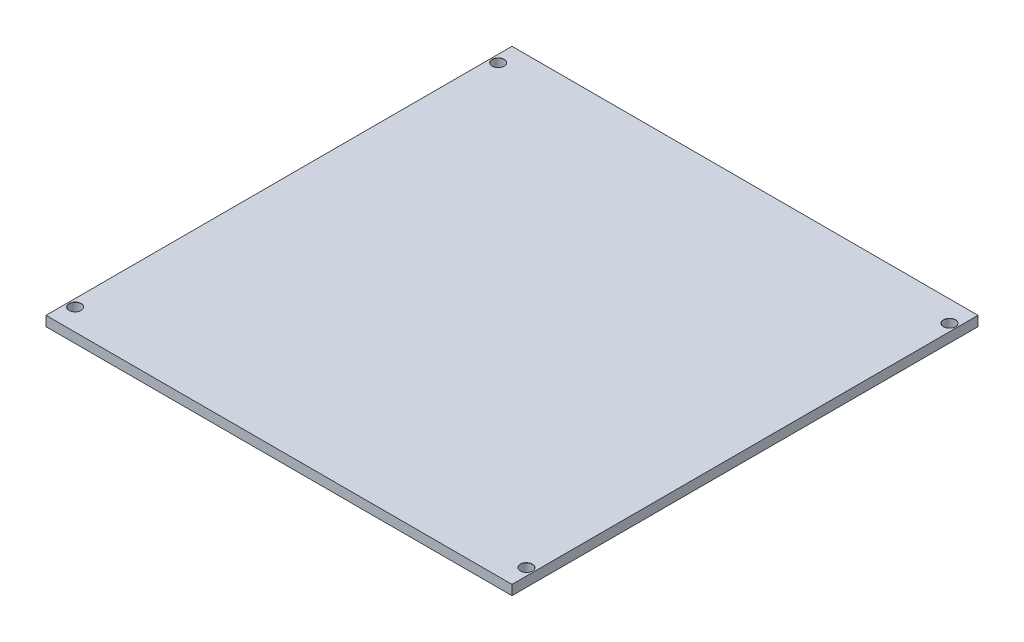
ISO-10303-21;
HEADER;
FILE_DESCRIPTION(('STEP AP214'),'2;1');
FILE_NAME('part.step','',(''),(''),'','','');
FILE_SCHEMA(('AUTOMOTIVE_DESIGN { 1 0 10303 214 1 1 1 1 }'));
ENDSEC;
DATA;
#1=APPLICATION_CONTEXT('core data for automotive mechanical design processes');
#2=APPLICATION_PROTOCOL_DEFINITION('international standard','automotive_design',2000,#1);
#3=PRODUCT_CONTEXT('',#1,'mechanical');
#4=PRODUCT('Part','Part','',(#3));
#5=PRODUCT_RELATED_PRODUCT_CATEGORY('part','',(#4));
#6=PRODUCT_DEFINITION_FORMATION('','',#4);
#7=PRODUCT_DEFINITION_CONTEXT('part definition',#1,'design');
#8=PRODUCT_DEFINITION('design','',#6,#7);
#9=PRODUCT_DEFINITION_SHAPE('','',#8);
#10=(LENGTH_UNIT() NAMED_UNIT(*) SI_UNIT(.MILLI.,.METRE.));
#11=(NAMED_UNIT(*) PLANE_ANGLE_UNIT() SI_UNIT($,.RADIAN.));
#12=(NAMED_UNIT(*) SI_UNIT($,.STERADIAN.) SOLID_ANGLE_UNIT());
#13=UNCERTAINTY_MEASURE_WITH_UNIT(LENGTH_MEASURE(1.E-05),#10,'distance_accuracy_value','');
#14=(GEOMETRIC_REPRESENTATION_CONTEXT(3) GLOBAL_UNCERTAINTY_ASSIGNED_CONTEXT((#13)) GLOBAL_UNIT_ASSIGNED_CONTEXT((#10,
#11,#12)) REPRESENTATION_CONTEXT('',''));
#15=CARTESIAN_POINT('',(0.,0.,0.));
#16=DIRECTION('',(0.,0.,1.));
#17=DIRECTION('',(1.,0.,0.));
#18=AXIS2_PLACEMENT_3D('',#15,#16,#17);
#19=CARTESIAN_POINT('',(0.,2.,0.));
#20=DIRECTION('',(0.,-1.,0.));
#21=DIRECTION('',(0.,0.,-1.));
#22=AXIS2_PLACEMENT_3D('',#19,#20,#21);
#23=PLANE('',#22);
#24=DIRECTION('',(0.,0.,-1.));
#25=VECTOR('',#24,1.);
#26=CARTESIAN_POINT('',(47.375,2.,47.375));
#27=LINE('',#26,#25);
#28=CARTESIAN_POINT('',(47.375,2.,47.375));
#29=VERTEX_POINT('',#28);
#30=CARTESIAN_POINT('',(47.375,2.,-47.375));
#31=VERTEX_POINT('',#30);
#32=EDGE_CURVE('E91',#29,#31,#27,.T.);
#33=ORIENTED_EDGE('',*,*,#32,.T.);
#34=DIRECTION('',(-1.,0.,0.));
#35=VECTOR('',#34,1.);
#36=CARTESIAN_POINT('',(-47.375,2.,-47.375));
#37=LINE('',#36,#35);
#38=CARTESIAN_POINT('',(-47.375,2.,-47.375));
#39=VERTEX_POINT('',#38);
#40=EDGE_CURVE('E86',#31,#39,#37,.T.);
#41=ORIENTED_EDGE('',*,*,#40,.T.);
#42=DIRECTION('',(0.,0.,1.));
#43=VECTOR('',#42,1.);
#44=CARTESIAN_POINT('',(-47.375,2.,47.375));
#45=LINE('',#44,#43);
#46=CARTESIAN_POINT('',(-47.375,2.,47.375));
#47=VERTEX_POINT('',#46);
#48=EDGE_CURVE('E89',#39,#47,#45,.T.);
#49=ORIENTED_EDGE('',*,*,#48,.T.);
#50=DIRECTION('',(1.,0.,0.));
#51=VECTOR('',#50,1.);
#52=CARTESIAN_POINT('',(-47.375,2.,47.375));
#53=LINE('',#52,#51);
#54=EDGE_CURVE('E56',#47,#29,#53,.T.);
#55=ORIENTED_EDGE('',*,*,#54,.T.);
#56=EDGE_LOOP('',(#33,#41,#49,#55));
#57=FACE_BOUND('',#56,.T.);
#58=CARTESIAN_POINT('',(45.875,2.,42.9529288111608));
#59=DIRECTION('',(0.,1.,0.));
#60=DIRECTION('',(0.,0.,1.));
#61=AXIS2_PLACEMENT_3D('',#58,#59,#60);
#62=CIRCLE('',#61,1.225);
#63=CARTESIAN_POINT('',(45.875,2.,44.1779288111608));
#64=VERTEX_POINT('',#63);
#65=EDGE_CURVE('E122',#64,#64,#62,.T.);
#66=ORIENTED_EDGE('',*,*,#65,.F.);
#67=EDGE_LOOP('',(#66));
#68=FACE_BOUND('',#67,.T.);
#69=CARTESIAN_POINT('',(-45.875,2.,42.9411563603076));
#70=DIRECTION('',(0.,1.,0.));
#71=DIRECTION('',(0.,0.,1.));
#72=AXIS2_PLACEMENT_3D('',#69,#70,#71);
#73=CIRCLE('',#72,1.225);
#74=CARTESIAN_POINT('',(-45.875,2.,44.1661563603076));
#75=VERTEX_POINT('',#74);
#76=EDGE_CURVE('E131',#75,#75,#73,.T.);
#77=ORIENTED_EDGE('',*,*,#76,.F.);
#78=EDGE_LOOP('',(#77));
#79=FACE_BOUND('',#78,.T.);
#80=CARTESIAN_POINT('',(-45.875,2.,-43.0719982494284));
#81=DIRECTION('',(0.,1.,0.));
#82=DIRECTION('',(0.,0.,1.));
#83=AXIS2_PLACEMENT_3D('',#80,#81,#82);
#84=CIRCLE('',#83,1.225);
#85=CARTESIAN_POINT('',(-45.875,2.,-41.8469982494284));
#86=VERTEX_POINT('',#85);
#87=EDGE_CURVE('E140',#86,#86,#84,.T.);
#88=ORIENTED_EDGE('',*,*,#87,.F.);
#89=EDGE_LOOP('',(#88));
#90=FACE_BOUND('',#89,.T.);
#91=CARTESIAN_POINT('',(45.875,2.,-43.0838884368115));
#92=DIRECTION('',(0.,1.,0.));
#93=DIRECTION('',(0.,0.,1.));
#94=AXIS2_PLACEMENT_3D('',#91,#92,#93);
#95=CIRCLE('',#94,1.225);
#96=CARTESIAN_POINT('',(45.875,2.,-41.8588884368115));
#97=VERTEX_POINT('',#96);
#98=EDGE_CURVE('E149',#97,#97,#95,.T.);
#99=ORIENTED_EDGE('',*,*,#98,.F.);
#100=EDGE_LOOP('',(#99));
#101=FACE_BOUND('',#100,.T.);
#102=ADVANCED_FACE('F39',(#57,#68,#79,#90,#101),#23,.F.);
#103=CARTESIAN_POINT('',(47.375,2.,47.375));
#104=DIRECTION('',(-1.,0.,0.));
#105=DIRECTION('',(0.,0.,1.));
#106=AXIS2_PLACEMENT_3D('',#103,#104,#105);
#107=PLANE('',#106);
#108=DIRECTION('',(0.,0.,-1.));
#109=VECTOR('',#108,1.);
#110=CARTESIAN_POINT('',(47.375,0.,47.375));
#111=LINE('',#110,#109);
#112=CARTESIAN_POINT('',(47.375,0.,47.375));
#113=VERTEX_POINT('',#112);
#114=CARTESIAN_POINT('',(47.375,0.,-47.375));
#115=VERTEX_POINT('',#114);
#116=EDGE_CURVE('E103',#113,#115,#111,.T.);
#117=ORIENTED_EDGE('',*,*,#116,.T.);
#118=DIRECTION('',(0.,-1.,0.));
#119=VECTOR('',#118,1.);
#120=CARTESIAN_POINT('',(47.375,2.,-47.375));
#121=LINE('',#120,#119);
#122=EDGE_CURVE('E11',#31,#115,#121,.T.);
#123=ORIENTED_EDGE('',*,*,#122,.F.);
#124=ORIENTED_EDGE('',*,*,#32,.F.);
#125=DIRECTION('',(0.,-1.,0.));
#126=VECTOR('',#125,1.);
#127=CARTESIAN_POINT('',(47.375,2.,47.375));
#128=LINE('',#127,#126);
#129=EDGE_CURVE('E99',#29,#113,#128,.T.);
#130=ORIENTED_EDGE('',*,*,#129,.T.);
#131=EDGE_LOOP('',(#117,#123,#124,#130));
#132=FACE_BOUND('',#131,.T.);
#133=ADVANCED_FACE('F41',(#132),#107,.F.);
#134=CARTESIAN_POINT('',(-47.375,2.,-47.375));
#135=DIRECTION('',(0.,0.,1.));
#136=DIRECTION('',(1.,0.,0.));
#137=AXIS2_PLACEMENT_3D('',#134,#135,#136);
#138=PLANE('',#137);
#139=DIRECTION('',(-1.,0.,0.));
#140=VECTOR('',#139,1.);
#141=CARTESIAN_POINT('',(-47.375,0.,-47.375));
#142=LINE('',#141,#140);
#143=CARTESIAN_POINT('',(-47.375,0.,-47.375));
#144=VERTEX_POINT('',#143);
#145=EDGE_CURVE('E95',#115,#144,#142,.T.);
#146=ORIENTED_EDGE('',*,*,#145,.T.);
#147=DIRECTION('',(0.,-1.,0.));
#148=VECTOR('',#147,1.);
#149=CARTESIAN_POINT('',(-47.375,2.,-47.375));
#150=LINE('',#149,#148);
#151=EDGE_CURVE('E48',#39,#144,#150,.T.);
#152=ORIENTED_EDGE('',*,*,#151,.F.);
#153=ORIENTED_EDGE('',*,*,#40,.F.);
#154=ORIENTED_EDGE('',*,*,#122,.T.);
#155=EDGE_LOOP('',(#146,#152,#153,#154));
#156=FACE_BOUND('',#155,.T.);
#157=ADVANCED_FACE('F94',(#156),#138,.F.);
#158=CARTESIAN_POINT('',(-47.375,2.,47.375));
#159=DIRECTION('',(1.,0.,0.));
#160=DIRECTION('',(0.,0.,-1.));
#161=AXIS2_PLACEMENT_3D('',#158,#159,#160);
#162=PLANE('',#161);
#163=DIRECTION('',(0.,0.,1.));
#164=VECTOR('',#163,1.);
#165=CARTESIAN_POINT('',(-47.375,0.,47.375));
#166=LINE('',#165,#164);
#167=CARTESIAN_POINT('',(-47.375,0.,47.375));
#168=VERTEX_POINT('',#167);
#169=EDGE_CURVE('E73',#144,#168,#166,.T.);
#170=ORIENTED_EDGE('',*,*,#169,.T.);
#171=DIRECTION('',(0.,-1.,0.));
#172=VECTOR('',#171,1.);
#173=CARTESIAN_POINT('',(-47.375,2.,47.375));
#174=LINE('',#173,#172);
#175=EDGE_CURVE('E96',#47,#168,#174,.T.);
#176=ORIENTED_EDGE('',*,*,#175,.F.);
#177=ORIENTED_EDGE('',*,*,#48,.F.);
#178=ORIENTED_EDGE('',*,*,#151,.T.);
#179=EDGE_LOOP('',(#170,#176,#177,#178));
#180=FACE_BOUND('',#179,.T.);
#181=ADVANCED_FACE('F97',(#180),#162,.F.);
#182=CARTESIAN_POINT('',(-47.375,2.,47.375));
#183=DIRECTION('',(0.,0.,-1.));
#184=DIRECTION('',(-1.,0.,0.));
#185=AXIS2_PLACEMENT_3D('',#182,#183,#184);
#186=PLANE('',#185);
#187=DIRECTION('',(1.,0.,0.));
#188=VECTOR('',#187,1.);
#189=CARTESIAN_POINT('',(-47.375,0.,47.375));
#190=LINE('',#189,#188);
#191=EDGE_CURVE('E79',#168,#113,#190,.T.);
#192=ORIENTED_EDGE('',*,*,#191,.T.);
#193=ORIENTED_EDGE('',*,*,#129,.F.);
#194=ORIENTED_EDGE('',*,*,#54,.F.);
#195=ORIENTED_EDGE('',*,*,#175,.T.);
#196=EDGE_LOOP('',(#192,#193,#194,#195));
#197=FACE_BOUND('',#196,.T.);
#198=ADVANCED_FACE('F111',(#197),#186,.F.);
#199=CARTESIAN_POINT('',(0.,0.,0.));
#200=DIRECTION('',(0.,-1.,0.));
#201=DIRECTION('',(0.,0.,-1.));
#202=AXIS2_PLACEMENT_3D('',#199,#200,#201);
#203=PLANE('',#202);
#204=CARTESIAN_POINT('',(45.875,0.,-43.0838884368115));
#205=DIRECTION('',(0.,-1.,0.));
#206=DIRECTION('',(0.,0.,-1.));
#207=AXIS2_PLACEMENT_3D('',#204,#205,#206);
#208=CIRCLE('',#207,1.2);
#209=CARTESIAN_POINT('',(45.875,0.,-44.2838884368115));
#210=VERTEX_POINT('',#209);
#211=EDGE_CURVE('E143',#210,#210,#208,.T.);
#212=ORIENTED_EDGE('',*,*,#211,.F.);
#213=EDGE_LOOP('',(#212));
#214=FACE_BOUND('',#213,.T.);
#215=CARTESIAN_POINT('',(-45.875,0.,-43.0719982494284));
#216=DIRECTION('',(0.,-1.,0.));
#217=DIRECTION('',(0.,0.,-1.));
#218=AXIS2_PLACEMENT_3D('',#215,#216,#217);
#219=CIRCLE('',#218,1.2);
#220=CARTESIAN_POINT('',(-45.875,0.,-44.2719982494284));
#221=VERTEX_POINT('',#220);
#222=EDGE_CURVE('E134',#221,#221,#219,.T.);
#223=ORIENTED_EDGE('',*,*,#222,.F.);
#224=EDGE_LOOP('',(#223));
#225=FACE_BOUND('',#224,.T.);
#226=CARTESIAN_POINT('',(-45.875,0.,42.9411563603076));
#227=DIRECTION('',(0.,-1.,0.));
#228=DIRECTION('',(0.,0.,-1.));
#229=AXIS2_PLACEMENT_3D('',#226,#227,#228);
#230=CIRCLE('',#229,1.2);
#231=CARTESIAN_POINT('',(-45.875,0.,41.7411563603076));
#232=VERTEX_POINT('',#231);
#233=EDGE_CURVE('E125',#232,#232,#230,.T.);
#234=ORIENTED_EDGE('',*,*,#233,.F.);
#235=EDGE_LOOP('',(#234));
#236=FACE_BOUND('',#235,.T.);
#237=CARTESIAN_POINT('',(45.875,0.,42.9529288111608));
#238=DIRECTION('',(0.,-1.,0.));
#239=DIRECTION('',(0.,0.,-1.));
#240=AXIS2_PLACEMENT_3D('',#237,#238,#239);
#241=CIRCLE('',#240,1.2);
#242=CARTESIAN_POINT('',(45.875,0.,41.7529288111608));
#243=VERTEX_POINT('',#242);
#244=EDGE_CURVE('E106',#243,#243,#241,.T.);
#245=ORIENTED_EDGE('',*,*,#244,.F.);
#246=EDGE_LOOP('',(#245));
#247=FACE_BOUND('',#246,.T.);
#248=ORIENTED_EDGE('',*,*,#116,.F.);
#249=ORIENTED_EDGE('',*,*,#191,.F.);
#250=ORIENTED_EDGE('',*,*,#169,.F.);
#251=ORIENTED_EDGE('',*,*,#145,.F.);
#252=EDGE_LOOP('',(#248,#249,#250,#251));
#253=FACE_BOUND('',#252,.T.);
#254=ADVANCED_FACE('F114',(#214,#225,#236,#247,#253),#203,.T.);
#255=CARTESIAN_POINT('',(45.875,2.,42.9529288111608));
#256=DIRECTION('',(0.,1.,0.));
#257=DIRECTION('',(0.,0.,1.));
#258=AXIS2_PLACEMENT_3D('',#255,#256,#257);
#259=CYLINDRICAL_SURFACE('',#258,1.2);
#260=CARTESIAN_POINT('',(45.875,1.975,42.9529288111608));
#261=DIRECTION('',(0.,1.,0.));
#262=DIRECTION('',(0.,0.,1.));
#263=AXIS2_PLACEMENT_3D('',#260,#261,#262);
#264=CIRCLE('',#263,1.2);
#265=CARTESIAN_POINT('',(45.875,1.975,44.1529288111608));
#266=VERTEX_POINT('',#265);
#267=EDGE_CURVE('E119',#266,#266,#264,.T.);
#268=ORIENTED_EDGE('',*,*,#267,.T.);
#269=EDGE_LOOP('',(#268));
#270=FACE_BOUND('',#269,.T.);
#271=ORIENTED_EDGE('',*,*,#244,.T.);
#272=EDGE_LOOP('',(#271));
#273=FACE_BOUND('',#272,.T.);
#274=ADVANCED_FACE('F164',(#270,#273),#259,.F.);
#275=CARTESIAN_POINT('',(45.875,2.,42.9529288111608));
#276=DIRECTION('',(0.,1.,0.));
#277=DIRECTION('',(0.,0.,1.));
#278=AXIS2_PLACEMENT_3D('',#275,#276,#277);
#279=CONICAL_SURFACE('',#278,1.225,0.785398163397396);
#280=ORIENTED_EDGE('',*,*,#267,.F.);
#281=EDGE_LOOP('',(#280));
#282=FACE_BOUND('',#281,.T.);
#283=ORIENTED_EDGE('',*,*,#65,.T.);
#284=EDGE_LOOP('',(#283));
#285=FACE_BOUND('',#284,.T.);
#286=ADVANCED_FACE('F205',(#282,#285),#279,.F.);
#287=CARTESIAN_POINT('',(-45.875,2.,42.9411563603076));
#288=DIRECTION('',(0.,1.,0.));
#289=DIRECTION('',(0.,0.,1.));
#290=AXIS2_PLACEMENT_3D('',#287,#288,#289);
#291=CYLINDRICAL_SURFACE('',#290,1.2);
#292=CARTESIAN_POINT('',(-45.875,1.975,42.9411563603076));
#293=DIRECTION('',(0.,1.,0.));
#294=DIRECTION('',(0.,0.,1.));
#295=AXIS2_PLACEMENT_3D('',#292,#293,#294);
#296=CIRCLE('',#295,1.2);
#297=CARTESIAN_POINT('',(-45.875,1.975,44.1411563603076));
#298=VERTEX_POINT('',#297);
#299=EDGE_CURVE('E128',#298,#298,#296,.T.);
#300=ORIENTED_EDGE('',*,*,#299,.T.);
#301=EDGE_LOOP('',(#300));
#302=FACE_BOUND('',#301,.T.);
#303=ORIENTED_EDGE('',*,*,#233,.T.);
#304=EDGE_LOOP('',(#303));
#305=FACE_BOUND('',#304,.T.);
#306=ADVANCED_FACE('F214',(#302,#305),#291,.F.);
#307=CARTESIAN_POINT('',(-45.875,2.,42.9411563603076));
#308=DIRECTION('',(0.,1.,0.));
#309=DIRECTION('',(0.,0.,1.));
#310=AXIS2_PLACEMENT_3D('',#307,#308,#309);
#311=CONICAL_SURFACE('',#310,1.225,0.785398163397396);
#312=ORIENTED_EDGE('',*,*,#299,.F.);
#313=EDGE_LOOP('',(#312));
#314=FACE_BOUND('',#313,.T.);
#315=ORIENTED_EDGE('',*,*,#76,.T.);
#316=EDGE_LOOP('',(#315));
#317=FACE_BOUND('',#316,.T.);
#318=ADVANCED_FACE('F223',(#314,#317),#311,.F.);
#319=CARTESIAN_POINT('',(-45.875,2.,-43.0719982494284));
#320=DIRECTION('',(0.,1.,0.));
#321=DIRECTION('',(0.,0.,1.));
#322=AXIS2_PLACEMENT_3D('',#319,#320,#321);
#323=CYLINDRICAL_SURFACE('',#322,1.2);
#324=CARTESIAN_POINT('',(-45.875,1.975,-43.0719982494284));
#325=DIRECTION('',(0.,1.,0.));
#326=DIRECTION('',(0.,0.,1.));
#327=AXIS2_PLACEMENT_3D('',#324,#325,#326);
#328=CIRCLE('',#327,1.2);
#329=CARTESIAN_POINT('',(-45.875,1.975,-41.8719982494284));
#330=VERTEX_POINT('',#329);
#331=EDGE_CURVE('E137',#330,#330,#328,.T.);
#332=ORIENTED_EDGE('',*,*,#331,.T.);
#333=EDGE_LOOP('',(#332));
#334=FACE_BOUND('',#333,.T.);
#335=ORIENTED_EDGE('',*,*,#222,.T.);
#336=EDGE_LOOP('',(#335));
#337=FACE_BOUND('',#336,.T.);
#338=ADVANCED_FACE('F233',(#334,#337),#323,.F.);
#339=CARTESIAN_POINT('',(-45.875,2.,-43.0719982494284));
#340=DIRECTION('',(0.,1.,0.));
#341=DIRECTION('',(0.,0.,1.));
#342=AXIS2_PLACEMENT_3D('',#339,#340,#341);
#343=CONICAL_SURFACE('',#342,1.225,0.785398163397396);
#344=ORIENTED_EDGE('',*,*,#331,.F.);
#345=EDGE_LOOP('',(#344));
#346=FACE_BOUND('',#345,.T.);
#347=ORIENTED_EDGE('',*,*,#87,.T.);
#348=EDGE_LOOP('',(#347));
#349=FACE_BOUND('',#348,.T.);
#350=ADVANCED_FACE('F243',(#346,#349),#343,.F.);
#351=CARTESIAN_POINT('',(45.875,2.,-43.0838884368115));
#352=DIRECTION('',(0.,1.,0.));
#353=DIRECTION('',(0.,0.,1.));
#354=AXIS2_PLACEMENT_3D('',#351,#352,#353);
#355=CYLINDRICAL_SURFACE('',#354,1.2);
#356=CARTESIAN_POINT('',(45.875,1.975,-43.0838884368115));
#357=DIRECTION('',(0.,1.,0.));
#358=DIRECTION('',(0.,0.,1.));
#359=AXIS2_PLACEMENT_3D('',#356,#357,#358);
#360=CIRCLE('',#359,1.2);
#361=CARTESIAN_POINT('',(45.875,1.975,-41.8838884368115));
#362=VERTEX_POINT('',#361);
#363=EDGE_CURVE('E146',#362,#362,#360,.T.);
#364=ORIENTED_EDGE('',*,*,#363,.T.);
#365=EDGE_LOOP('',(#364));
#366=FACE_BOUND('',#365,.T.);
#367=ORIENTED_EDGE('',*,*,#211,.T.);
#368=EDGE_LOOP('',(#367));
#369=FACE_BOUND('',#368,.T.);
#370=ADVANCED_FACE('F253',(#366,#369),#355,.F.);
#371=CARTESIAN_POINT('',(45.875,2.,-43.0838884368115));
#372=DIRECTION('',(0.,1.,0.));
#373=DIRECTION('',(0.,0.,1.));
#374=AXIS2_PLACEMENT_3D('',#371,#372,#373);
#375=CONICAL_SURFACE('',#374,1.225,0.785398163397396);
#376=ORIENTED_EDGE('',*,*,#363,.F.);
#377=EDGE_LOOP('',(#376));
#378=FACE_BOUND('',#377,.T.);
#379=ORIENTED_EDGE('',*,*,#98,.T.);
#380=EDGE_LOOP('',(#379));
#381=FACE_BOUND('',#380,.T.);
#382=ADVANCED_FACE('F153',(#378,#381),#375,.F.);
#383=CLOSED_SHELL('',(#102,#133,#157,#181,#198,#254,#274,#286,#306,#318,#338,#350,#370,#382));
#384=MANIFOLD_SOLID_BREP('B2',#383);
#385=ADVANCED_BREP_SHAPE_REPRESENTATION('',(#18,#384),#14);
#386=SHAPE_DEFINITION_REPRESENTATION(#9,#385);
ENDSEC;
END-ISO-10303-21;
